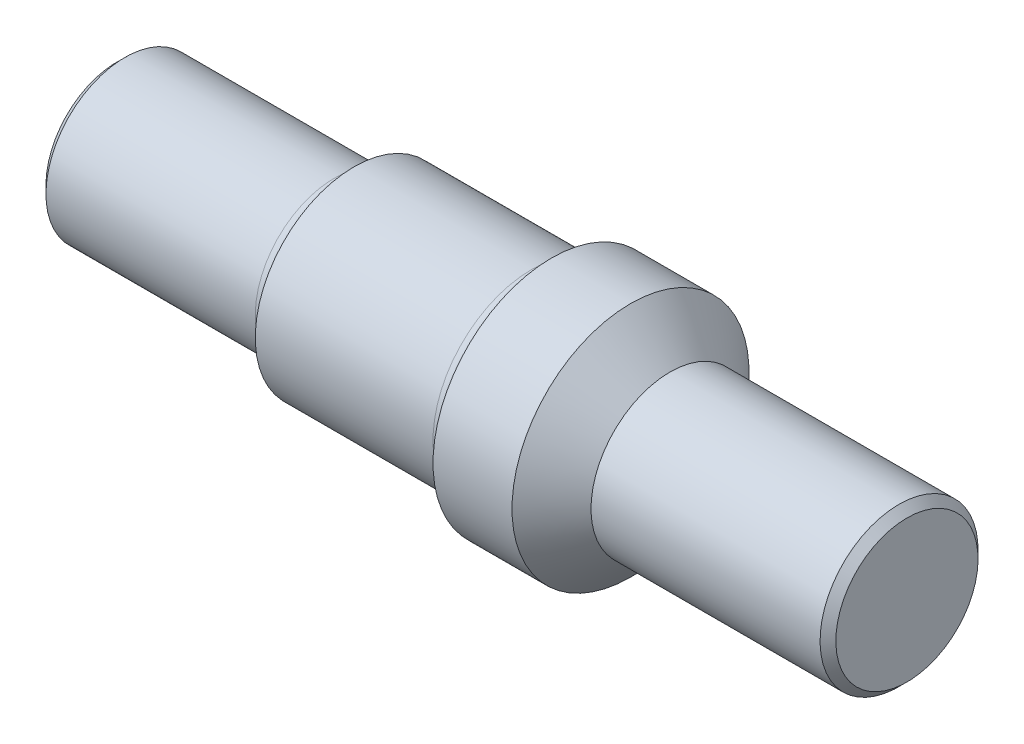
ISO-10303-21;
HEADER;
FILE_DESCRIPTION(('STEP AP214'),'2;1');
FILE_NAME('part.step','',(''),(''),'','','');
FILE_SCHEMA(('AUTOMOTIVE_DESIGN { 1 0 10303 214 1 1 1 1 }'));
ENDSEC;
DATA;
#1=APPLICATION_CONTEXT('core data for automotive mechanical design processes');
#2=APPLICATION_PROTOCOL_DEFINITION('international standard','automotive_design',2000,#1);
#3=PRODUCT_CONTEXT('',#1,'mechanical');
#4=PRODUCT('Part','Part','',(#3));
#5=PRODUCT_RELATED_PRODUCT_CATEGORY('part','',(#4));
#6=PRODUCT_DEFINITION_FORMATION('','',#4);
#7=PRODUCT_DEFINITION_CONTEXT('part definition',#1,'design');
#8=PRODUCT_DEFINITION('design','',#6,#7);
#9=PRODUCT_DEFINITION_SHAPE('','',#8);
#10=(LENGTH_UNIT() NAMED_UNIT(*) SI_UNIT(.MILLI.,.METRE.));
#11=(NAMED_UNIT(*) PLANE_ANGLE_UNIT() SI_UNIT($,.RADIAN.));
#12=(NAMED_UNIT(*) SI_UNIT($,.STERADIAN.) SOLID_ANGLE_UNIT());
#13=UNCERTAINTY_MEASURE_WITH_UNIT(LENGTH_MEASURE(1.E-05),#10,'distance_accuracy_value','');
#14=(GEOMETRIC_REPRESENTATION_CONTEXT(3) GLOBAL_UNCERTAINTY_ASSIGNED_CONTEXT((#13)) GLOBAL_UNIT_ASSIGNED_CONTEXT((#10,
#11,#12)) REPRESENTATION_CONTEXT('',''));
#15=CARTESIAN_POINT('',(0.,0.,0.));
#16=DIRECTION('',(0.,0.,1.));
#17=DIRECTION('',(1.,0.,0.));
#18=AXIS2_PLACEMENT_3D('',#15,#16,#17);
#19=CARTESIAN_POINT('',(0.,0.,0.));
#20=DIRECTION('',(-1.,0.,0.));
#21=DIRECTION('',(0.,-1.,0.));
#22=AXIS2_PLACEMENT_3D('',#19,#20,#21);
#23=PLANE('',#22);
#24=CARTESIAN_POINT('',(0.,0.,0.));
#25=DIRECTION('',(-1.,0.,0.));
#26=DIRECTION('',(0.,-1.,0.));
#27=AXIS2_PLACEMENT_3D('',#24,#25,#26);
#28=CIRCLE('',#27,9.00000000000001);
#29=CARTESIAN_POINT('',(0.,-9.00000000000001,0.));
#30=VERTEX_POINT('',#29);
#31=EDGE_CURVE('E10',#30,#30,#28,.T.);
#32=ORIENTED_EDGE('',*,*,#31,.T.);
#33=EDGE_LOOP('',(#32));
#34=FACE_BOUND('',#33,.T.);
#35=ADVANCED_FACE('F31',(#34),#23,.T.);
#36=CARTESIAN_POINT('',(100.,0.,0.));
#37=DIRECTION('',(1.,0.,0.));
#38=DIRECTION('',(0.,1.,0.));
#39=AXIS2_PLACEMENT_3D('',#36,#37,#38);
#40=CYLINDRICAL_SURFACE('',#39,10.);
#41=CARTESIAN_POINT('',(0.999999999999987,0.,0.));
#42=DIRECTION('',(-1.,0.,0.));
#43=DIRECTION('',(0.,-1.,0.));
#44=AXIS2_PLACEMENT_3D('',#41,#42,#43);
#45=CIRCLE('',#44,10.);
#46=CARTESIAN_POINT('',(0.999999999999987,-10.,0.));
#47=VERTEX_POINT('',#46);
#48=EDGE_CURVE('E38',#47,#47,#45,.F.);
#49=ORIENTED_EDGE('',*,*,#48,.T.);
#50=EDGE_LOOP('',(#49));
#51=FACE_BOUND('',#50,.T.);
#52=CARTESIAN_POINT('',(27.5,0.,0.));
#53=DIRECTION('',(-1.,0.,0.));
#54=DIRECTION('',(0.,-1.,0.));
#55=AXIS2_PLACEMENT_3D('',#52,#53,#54);
#56=CIRCLE('',#55,10.);
#57=CARTESIAN_POINT('',(27.5,-10.,0.));
#58=VERTEX_POINT('',#57);
#59=EDGE_CURVE('E51',#58,#58,#56,.T.);
#60=ORIENTED_EDGE('',*,*,#59,.T.);
#61=EDGE_LOOP('',(#60));
#62=FACE_BOUND('',#61,.T.);
#63=ADVANCED_FACE('F88',(#51,#62),#40,.T.);
#64=CARTESIAN_POINT('',(100.,0.,0.));
#65=DIRECTION('',(1.,0.,0.));
#66=DIRECTION('',(0.,1.,0.));
#67=AXIS2_PLACEMENT_3D('',#64,#65,#66);
#68=CYLINDRICAL_SURFACE('',#67,12.5);
#69=CARTESIAN_POINT('',(52.5,0.,0.));
#70=DIRECTION('',(-1.,0.,0.));
#71=DIRECTION('',(0.,-1.,0.));
#72=AXIS2_PLACEMENT_3D('',#69,#70,#71);
#73=CIRCLE('',#72,12.5);
#74=CARTESIAN_POINT('',(52.5,-12.5,0.));
#75=VERTEX_POINT('',#74);
#76=EDGE_CURVE('E54',#75,#75,#73,.T.);
#77=ORIENTED_EDGE('',*,*,#76,.T.);
#78=EDGE_LOOP('',(#77));
#79=FACE_BOUND('',#78,.T.);
#80=CARTESIAN_POINT('',(30.,0.,0.));
#81=DIRECTION('',(1.,0.,0.));
#82=DIRECTION('',(0.,1.,0.));
#83=AXIS2_PLACEMENT_3D('',#80,#81,#82);
#84=CIRCLE('',#83,12.5);
#85=CARTESIAN_POINT('',(30.,12.5,0.));
#86=VERTEX_POINT('',#85);
#87=EDGE_CURVE('E57',#86,#86,#84,.T.);
#88=ORIENTED_EDGE('',*,*,#87,.T.);
#89=EDGE_LOOP('',(#88));
#90=FACE_BOUND('',#89,.T.);
#91=ADVANCED_FACE('F84',(#79,#90),#68,.T.);
#92=CARTESIAN_POINT('',(100.,0.,0.));
#93=DIRECTION('',(1.,0.,0.));
#94=DIRECTION('',(0.,1.,0.));
#95=AXIS2_PLACEMENT_3D('',#92,#93,#94);
#96=CYLINDRICAL_SURFACE('',#95,15.);
#97=CARTESIAN_POINT('',(55.,0.,0.));
#98=DIRECTION('',(1.,0.,0.));
#99=DIRECTION('',(0.,1.,0.));
#100=AXIS2_PLACEMENT_3D('',#97,#98,#99);
#101=CIRCLE('',#100,15.);
#102=CARTESIAN_POINT('',(55.,15.,0.));
#103=VERTEX_POINT('',#102);
#104=EDGE_CURVE('E60',#103,#103,#101,.T.);
#105=ORIENTED_EDGE('',*,*,#104,.T.);
#106=EDGE_LOOP('',(#105));
#107=FACE_BOUND('',#106,.T.);
#108=CARTESIAN_POINT('',(65.0000000000001,0.,0.));
#109=DIRECTION('',(1.,0.,0.));
#110=DIRECTION('',(0.,1.,0.));
#111=AXIS2_PLACEMENT_3D('',#108,#109,#110);
#112=CIRCLE('',#111,15.);
#113=CARTESIAN_POINT('',(65.0000000000001,15.,0.));
#114=VERTEX_POINT('',#113);
#115=EDGE_CURVE('E63',#114,#114,#112,.T.);
#116=ORIENTED_EDGE('',*,*,#115,.F.);
#117=EDGE_LOOP('',(#116));
#118=FACE_BOUND('',#117,.T.);
#119=ADVANCED_FACE('F74',(#107,#118),#96,.T.);
#120=CARTESIAN_POINT('',(70.0000000000001,0.,0.));
#121=DIRECTION('',(-1.,0.,0.));
#122=DIRECTION('',(0.,-1.,0.));
#123=AXIS2_PLACEMENT_3D('',#120,#121,#122);
#124=CONICAL_SURFACE('',#123,10.,0.785398163397448);
#125=ORIENTED_EDGE('',*,*,#115,.T.);
#126=EDGE_LOOP('',(#125));
#127=FACE_BOUND('',#126,.T.);
#128=CARTESIAN_POINT('',(70.0000000000001,0.,0.));
#129=DIRECTION('',(1.,0.,0.));
#130=DIRECTION('',(0.,1.,0.));
#131=AXIS2_PLACEMENT_3D('',#128,#129,#130);
#132=CIRCLE('',#131,10.);
#133=CARTESIAN_POINT('',(70.0000000000001,10.,0.));
#134=VERTEX_POINT('',#133);
#135=EDGE_CURVE('E66',#134,#134,#132,.T.);
#136=ORIENTED_EDGE('',*,*,#135,.F.);
#137=EDGE_LOOP('',(#136));
#138=FACE_BOUND('',#137,.T.);
#139=ADVANCED_FACE('F72',(#127,#138),#124,.T.);
#140=CARTESIAN_POINT('',(100.,0.,0.));
#141=DIRECTION('',(1.,0.,0.));
#142=DIRECTION('',(0.,1.,0.));
#143=AXIS2_PLACEMENT_3D('',#140,#141,#142);
#144=CYLINDRICAL_SURFACE('',#143,10.);
#145=CARTESIAN_POINT('',(99.0000000000001,0.,0.));
#146=DIRECTION('',(1.,0.,0.));
#147=DIRECTION('',(0.,1.,0.));
#148=AXIS2_PLACEMENT_3D('',#145,#146,#147);
#149=CIRCLE('',#148,10.);
#150=CARTESIAN_POINT('',(99.0000000000001,10.,0.));
#151=VERTEX_POINT('',#150);
#152=EDGE_CURVE('E42',#151,#151,#149,.F.);
#153=ORIENTED_EDGE('',*,*,#152,.T.);
#154=EDGE_LOOP('',(#153));
#155=FACE_BOUND('',#154,.T.);
#156=ORIENTED_EDGE('',*,*,#135,.T.);
#157=EDGE_LOOP('',(#156));
#158=FACE_BOUND('',#157,.T.);
#159=ADVANCED_FACE('F70',(#155,#158),#144,.T.);
#160=CARTESIAN_POINT('',(100.,10.,0.));
#161=DIRECTION('',(1.,0.,0.));
#162=DIRECTION('',(0.,1.,0.));
#163=AXIS2_PLACEMENT_3D('',#160,#161,#162);
#164=PLANE('',#163);
#165=CARTESIAN_POINT('',(100.,0.,0.));
#166=DIRECTION('',(1.,0.,0.));
#167=DIRECTION('',(0.,1.,0.));
#168=AXIS2_PLACEMENT_3D('',#165,#166,#167);
#169=CIRCLE('',#168,8.99999999999999);
#170=CARTESIAN_POINT('',(100.,8.99999999999999,0.));
#171=VERTEX_POINT('',#170);
#172=EDGE_CURVE('E46',#171,#171,#169,.T.);
#173=ORIENTED_EDGE('',*,*,#172,.T.);
#174=EDGE_LOOP('',(#173));
#175=FACE_BOUND('',#174,.T.);
#176=ADVANCED_FACE('F81',(#175),#164,.T.);
#177=CARTESIAN_POINT('',(52.5,0.,0.));
#178=DIRECTION('',(-1.,0.,0.));
#179=DIRECTION('',(0.,-1.,0.));
#180=AXIS2_PLACEMENT_3D('',#177,#178,#179);
#181=TOROIDAL_SURFACE('',#180,15.,2.5);
#182=ORIENTED_EDGE('',*,*,#76,.F.);
#183=EDGE_LOOP('',(#182));
#184=FACE_BOUND('',#183,.T.);
#185=ORIENTED_EDGE('',*,*,#104,.F.);
#186=EDGE_LOOP('',(#185));
#187=FACE_BOUND('',#186,.T.);
#188=ADVANCED_FACE('F96',(#184,#187),#181,.F.);
#189=CARTESIAN_POINT('',(27.5,0.,0.));
#190=DIRECTION('',(-1.,0.,0.));
#191=DIRECTION('',(0.,-1.,0.));
#192=AXIS2_PLACEMENT_3D('',#189,#190,#191);
#193=TOROIDAL_SURFACE('',#192,12.5,2.5);
#194=ORIENTED_EDGE('',*,*,#59,.F.);
#195=EDGE_LOOP('',(#194));
#196=FACE_BOUND('',#195,.T.);
#197=ORIENTED_EDGE('',*,*,#87,.F.);
#198=EDGE_LOOP('',(#197));
#199=FACE_BOUND('',#198,.T.);
#200=ADVANCED_FACE('F99',(#196,#199),#193,.F.);
#201=CARTESIAN_POINT('',(100.,0.,0.));
#202=DIRECTION('',(-1.,0.,0.));
#203=DIRECTION('',(0.,-1.,0.));
#204=AXIS2_PLACEMENT_3D('',#201,#202,#203);
#205=CONICAL_SURFACE('',#204,8.99999999999999,0.785398163397451);
#206=ORIENTED_EDGE('',*,*,#152,.F.);
#207=EDGE_LOOP('',(#206));
#208=FACE_BOUND('',#207,.T.);
#209=ORIENTED_EDGE('',*,*,#172,.F.);
#210=EDGE_LOOP('',(#209));
#211=FACE_BOUND('',#210,.T.);
#212=ADVANCED_FACE('F102',(#208,#211),#205,.T.);
#213=CARTESIAN_POINT('',(0.999999999999987,0.,0.));
#214=DIRECTION('',(1.,0.,0.));
#215=DIRECTION('',(0.,1.,0.));
#216=AXIS2_PLACEMENT_3D('',#213,#214,#215);
#217=CONICAL_SURFACE('',#216,10.,0.785398163397451);
#218=ORIENTED_EDGE('',*,*,#31,.F.);
#219=EDGE_LOOP('',(#218));
#220=FACE_BOUND('',#219,.T.);
#221=ORIENTED_EDGE('',*,*,#48,.F.);
#222=EDGE_LOOP('',(#221));
#223=FACE_BOUND('',#222,.T.);
#224=ADVANCED_FACE('F33',(#220,#223),#217,.T.);
#225=CLOSED_SHELL('',(#35,#63,#91,#119,#139,#159,#176,#188,#200,#212,#224));
#226=MANIFOLD_SOLID_BREP('B2',#225);
#227=ADVANCED_BREP_SHAPE_REPRESENTATION('',(#18,#226),#14);
#228=SHAPE_DEFINITION_REPRESENTATION(#9,#227);
ENDSEC;
END-ISO-10303-21;
